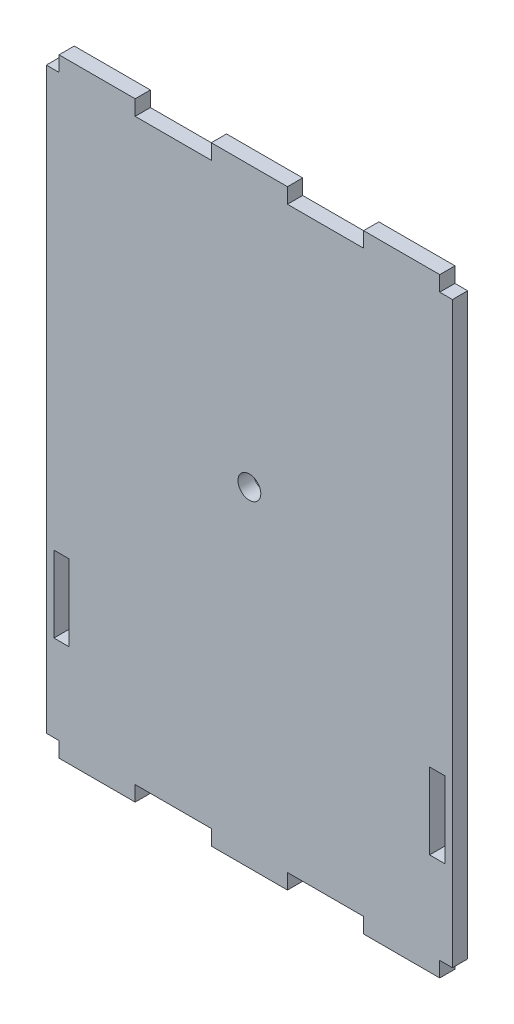
ISO-10303-21;
HEADER;
FILE_DESCRIPTION(('STEP AP214'),'2;1');
FILE_NAME('part.step','',(''),(''),'','','');
FILE_SCHEMA(('AUTOMOTIVE_DESIGN { 1 0 10303 214 1 1 1 1 }'));
ENDSEC;
DATA;
#1=APPLICATION_CONTEXT('core data for automotive mechanical design processes');
#2=APPLICATION_PROTOCOL_DEFINITION('international standard','automotive_design',2000,#1);
#3=PRODUCT_CONTEXT('',#1,'mechanical');
#4=PRODUCT('Part','Part','',(#3));
#5=PRODUCT_RELATED_PRODUCT_CATEGORY('part','',(#4));
#6=PRODUCT_DEFINITION_FORMATION('','',#4);
#7=PRODUCT_DEFINITION_CONTEXT('part definition',#1,'design');
#8=PRODUCT_DEFINITION('design','',#6,#7);
#9=PRODUCT_DEFINITION_SHAPE('','',#8);
#10=(LENGTH_UNIT() NAMED_UNIT(*) SI_UNIT(.MILLI.,.METRE.));
#11=(NAMED_UNIT(*) PLANE_ANGLE_UNIT() SI_UNIT($,.RADIAN.));
#12=(NAMED_UNIT(*) SI_UNIT($,.STERADIAN.) SOLID_ANGLE_UNIT());
#13=UNCERTAINTY_MEASURE_WITH_UNIT(LENGTH_MEASURE(1.E-05),#10,'distance_accuracy_value','');
#14=(GEOMETRIC_REPRESENTATION_CONTEXT(3) GLOBAL_UNCERTAINTY_ASSIGNED_CONTEXT((#13)) GLOBAL_UNIT_ASSIGNED_CONTEXT((#10,
#11,#12)) REPRESENTATION_CONTEXT('',''));
#15=CARTESIAN_POINT('',(0.,0.,0.));
#16=DIRECTION('',(0.,0.,1.));
#17=DIRECTION('',(1.,0.,0.));
#18=AXIS2_PLACEMENT_3D('',#15,#16,#17);
#19=CARTESIAN_POINT('',(0.,0.,3.));
#20=DIRECTION('',(0.,0.,-1.));
#21=DIRECTION('',(-1.,0.,0.));
#22=AXIS2_PLACEMENT_3D('',#19,#20,#21);
#23=PLANE('',#22);
#24=CARTESIAN_POINT('',(40.,65.,3.));
#25=DIRECTION('',(0.,0.,1.));
#26=DIRECTION('',(1.,0.,0.));
#27=AXIS2_PLACEMENT_3D('',#24,#25,#26);
#28=CIRCLE('',#27,2.25);
#29=CARTESIAN_POINT('',(42.25,65.,3.));
#30=VERTEX_POINT('',#29);
#31=EDGE_CURVE('E1194',#30,#30,#28,.T.);
#32=ORIENTED_EDGE('',*,*,#31,.F.);
#33=EDGE_LOOP('',(#32));
#34=FACE_BOUND('',#33,.T.);
#35=DIRECTION('',(0.,1.,0.));
#36=VECTOR('',#35,1.);
#37=CARTESIAN_POINT('',(78.5,20.,3.));
#38=LINE('',#37,#36);
#39=CARTESIAN_POINT('',(78.5,20.,3.));
#40=VERTEX_POINT('',#39);
#41=CARTESIAN_POINT('',(78.5,35.,3.));
#42=VERTEX_POINT('',#41);
#43=EDGE_CURVE('E326',#40,#42,#38,.T.);
#44=ORIENTED_EDGE('',*,*,#43,.F.);
#45=DIRECTION('',(1.,0.,0.));
#46=VECTOR('',#45,1.);
#47=CARTESIAN_POINT('',(78.5,20.,3.));
#48=LINE('',#47,#46);
#49=CARTESIAN_POINT('',(75.5,20.,3.));
#50=VERTEX_POINT('',#49);
#51=EDGE_CURVE('E337',#50,#40,#48,.T.);
#52=ORIENTED_EDGE('',*,*,#51,.F.);
#53=DIRECTION('',(0.,-1.,0.));
#54=VECTOR('',#53,1.);
#55=CARTESIAN_POINT('',(75.5,20.,3.));
#56=LINE('',#55,#54);
#57=CARTESIAN_POINT('',(75.5,35.,3.));
#58=VERTEX_POINT('',#57);
#59=EDGE_CURVE('E333',#58,#50,#56,.T.);
#60=ORIENTED_EDGE('',*,*,#59,.F.);
#61=DIRECTION('',(-1.,0.,0.));
#62=VECTOR('',#61,1.);
#63=CARTESIAN_POINT('',(78.5,35.,3.));
#64=LINE('',#63,#62);
#65=EDGE_CURVE('E329',#42,#58,#64,.T.);
#66=ORIENTED_EDGE('',*,*,#65,.F.);
#67=EDGE_LOOP('',(#44,#52,#60,#66));
#68=FACE_BOUND('',#67,.T.);
#69=DIRECTION('',(0.,-1.,0.));
#70=VECTOR('',#69,1.);
#71=CARTESIAN_POINT('',(32.5,0.,3.));
#72=LINE('',#71,#70);
#73=CARTESIAN_POINT('',(32.5,3.00000000000001,3.));
#74=VERTEX_POINT('',#73);
#75=CARTESIAN_POINT('',(32.5,0.,3.));
#76=VERTEX_POINT('',#75);
#77=EDGE_CURVE('E369',#74,#76,#72,.T.);
#78=ORIENTED_EDGE('',*,*,#77,.T.);
#79=DIRECTION('',(1.,0.,0.));
#80=VECTOR('',#79,1.);
#81=CARTESIAN_POINT('',(32.5,0.,3.));
#82=LINE('',#81,#80);
#83=CARTESIAN_POINT('',(47.5,0.,3.));
#84=VERTEX_POINT('',#83);
#85=EDGE_CURVE('E373',#76,#84,#82,.T.);
#86=ORIENTED_EDGE('',*,*,#85,.T.);
#87=DIRECTION('',(0.,1.,0.));
#88=VECTOR('',#87,1.);
#89=CARTESIAN_POINT('',(47.5,0.,3.));
#90=LINE('',#89,#88);
#91=CARTESIAN_POINT('',(47.5,3.00000000000002,3.));
#92=VERTEX_POINT('',#91);
#93=EDGE_CURVE('E377',#84,#92,#90,.T.);
#94=ORIENTED_EDGE('',*,*,#93,.T.);
#95=DIRECTION('',(1.,0.,0.));
#96=VECTOR('',#95,1.);
#97=CARTESIAN_POINT('',(47.5,3.00000000000002,3.));
#98=LINE('',#97,#96);
#99=CARTESIAN_POINT('',(62.5,3.00000000000002,3.));
#100=VERTEX_POINT('',#99);
#101=EDGE_CURVE('E380',#92,#100,#98,.T.);
#102=ORIENTED_EDGE('',*,*,#101,.T.);
#103=DIRECTION('',(0.,-1.,0.));
#104=VECTOR('',#103,1.);
#105=CARTESIAN_POINT('',(62.5,0.,3.));
#106=LINE('',#105,#104);
#107=CARTESIAN_POINT('',(62.5,0.,3.));
#108=VERTEX_POINT('',#107);
#109=EDGE_CURVE('E383',#100,#108,#106,.T.);
#110=ORIENTED_EDGE('',*,*,#109,.T.);
#111=DIRECTION('',(1.,0.,0.));
#112=VECTOR('',#111,1.);
#113=CARTESIAN_POINT('',(62.5,0.,3.));
#114=LINE('',#113,#112);
#115=CARTESIAN_POINT('',(77.5,0.,3.));
#116=VERTEX_POINT('',#115);
#117=EDGE_CURVE('E386',#108,#116,#114,.T.);
#118=ORIENTED_EDGE('',*,*,#117,.T.);
#119=DIRECTION('',(0.,1.,0.));
#120=VECTOR('',#119,1.);
#121=CARTESIAN_POINT('',(77.5,0.,3.));
#122=LINE('',#121,#120);
#123=CARTESIAN_POINT('',(77.5,3.00000000000003,3.));
#124=VERTEX_POINT('',#123);
#125=EDGE_CURVE('E389',#116,#124,#122,.T.);
#126=ORIENTED_EDGE('',*,*,#125,.T.);
#127=DIRECTION('',(1.,0.,0.));
#128=VECTOR('',#127,1.);
#129=CARTESIAN_POINT('',(77.5,3.00000000000003,3.));
#130=LINE('',#129,#128);
#131=CARTESIAN_POINT('',(80.,3.00000000000001,3.));
#132=VERTEX_POINT('',#131);
#133=EDGE_CURVE('E392',#124,#132,#130,.T.);
#134=ORIENTED_EDGE('',*,*,#133,.T.);
#135=DIRECTION('',(0.,1.,0.));
#136=VECTOR('',#135,1.);
#137=CARTESIAN_POINT('',(80.,3.00000000000001,3.));
#138=LINE('',#137,#136);
#139=CARTESIAN_POINT('',(80.,117.,3.));
#140=VERTEX_POINT('',#139);
#141=EDGE_CURVE('E395',#132,#140,#138,.T.);
#142=ORIENTED_EDGE('',*,*,#141,.T.);
#143=DIRECTION('',(-1.,0.,0.));
#144=VECTOR('',#143,1.);
#145=CARTESIAN_POINT('',(77.5,117.,3.));
#146=LINE('',#145,#144);
#147=CARTESIAN_POINT('',(77.5,117.,3.));
#148=VERTEX_POINT('',#147);
#149=EDGE_CURVE('E398',#140,#148,#146,.T.);
#150=ORIENTED_EDGE('',*,*,#149,.T.);
#151=DIRECTION('',(0.,1.,0.));
#152=VECTOR('',#151,1.);
#153=CARTESIAN_POINT('',(77.5,120.,3.));
#154=LINE('',#153,#152);
#155=CARTESIAN_POINT('',(77.5,120.,3.));
#156=VERTEX_POINT('',#155);
#157=EDGE_CURVE('E401',#148,#156,#154,.T.);
#158=ORIENTED_EDGE('',*,*,#157,.T.);
#159=DIRECTION('',(-1.,0.,0.));
#160=VECTOR('',#159,1.);
#161=CARTESIAN_POINT('',(77.5,120.,3.));
#162=LINE('',#161,#160);
#163=CARTESIAN_POINT('',(62.5,120.,3.));
#164=VERTEX_POINT('',#163);
#165=EDGE_CURVE('E404',#156,#164,#162,.T.);
#166=ORIENTED_EDGE('',*,*,#165,.T.);
#167=DIRECTION('',(0.,-1.,0.));
#168=VECTOR('',#167,1.);
#169=CARTESIAN_POINT('',(62.5,120.,3.));
#170=LINE('',#169,#168);
#171=CARTESIAN_POINT('',(62.5,117.,3.));
#172=VERTEX_POINT('',#171);
#173=EDGE_CURVE('E407',#164,#172,#170,.T.);
#174=ORIENTED_EDGE('',*,*,#173,.T.);
#175=DIRECTION('',(-1.,0.,0.));
#176=VECTOR('',#175,1.);
#177=CARTESIAN_POINT('',(47.5,117.,3.));
#178=LINE('',#177,#176);
#179=CARTESIAN_POINT('',(47.5,117.,3.));
#180=VERTEX_POINT('',#179);
#181=EDGE_CURVE('E410',#172,#180,#178,.T.);
#182=ORIENTED_EDGE('',*,*,#181,.T.);
#183=DIRECTION('',(0.,1.,0.));
#184=VECTOR('',#183,1.);
#185=CARTESIAN_POINT('',(47.5,120.,3.));
#186=LINE('',#185,#184);
#187=CARTESIAN_POINT('',(47.5,120.,3.));
#188=VERTEX_POINT('',#187);
#189=EDGE_CURVE('E413',#180,#188,#186,.T.);
#190=ORIENTED_EDGE('',*,*,#189,.T.);
#191=DIRECTION('',(-1.,0.,0.));
#192=VECTOR('',#191,1.);
#193=CARTESIAN_POINT('',(32.5,120.,3.));
#194=LINE('',#193,#192);
#195=CARTESIAN_POINT('',(32.5,120.,3.));
#196=VERTEX_POINT('',#195);
#197=EDGE_CURVE('E416',#188,#196,#194,.T.);
#198=ORIENTED_EDGE('',*,*,#197,.T.);
#199=DIRECTION('',(0.,-1.,0.));
#200=VECTOR('',#199,1.);
#201=CARTESIAN_POINT('',(32.5,120.,3.));
#202=LINE('',#201,#200);
#203=CARTESIAN_POINT('',(32.5,117.,3.));
#204=VERTEX_POINT('',#203);
#205=EDGE_CURVE('E419',#196,#204,#202,.T.);
#206=ORIENTED_EDGE('',*,*,#205,.T.);
#207=DIRECTION('',(-1.,0.,0.));
#208=VECTOR('',#207,1.);
#209=CARTESIAN_POINT('',(17.5,117.,3.));
#210=LINE('',#209,#208);
#211=CARTESIAN_POINT('',(17.5,117.,3.));
#212=VERTEX_POINT('',#211);
#213=EDGE_CURVE('E422',#204,#212,#210,.T.);
#214=ORIENTED_EDGE('',*,*,#213,.T.);
#215=DIRECTION('',(0.,1.,0.));
#216=VECTOR('',#215,1.);
#217=CARTESIAN_POINT('',(17.5,120.,3.));
#218=LINE('',#217,#216);
#219=CARTESIAN_POINT('',(17.5,120.,3.));
#220=VERTEX_POINT('',#219);
#221=EDGE_CURVE('E425',#212,#220,#218,.T.);
#222=ORIENTED_EDGE('',*,*,#221,.T.);
#223=DIRECTION('',(-1.,0.,0.));
#224=VECTOR('',#223,1.);
#225=CARTESIAN_POINT('',(2.5,120.,3.));
#226=LINE('',#225,#224);
#227=CARTESIAN_POINT('',(2.5,120.,3.));
#228=VERTEX_POINT('',#227);
#229=EDGE_CURVE('E428',#220,#228,#226,.T.);
#230=ORIENTED_EDGE('',*,*,#229,.T.);
#231=DIRECTION('',(0.,-1.,0.));
#232=VECTOR('',#231,1.);
#233=CARTESIAN_POINT('',(2.5,120.,3.));
#234=LINE('',#233,#232);
#235=CARTESIAN_POINT('',(2.5,117.,3.));
#236=VERTEX_POINT('',#235);
#237=EDGE_CURVE('E431',#228,#236,#234,.T.);
#238=ORIENTED_EDGE('',*,*,#237,.T.);
#239=DIRECTION('',(-1.,0.,0.));
#240=VECTOR('',#239,1.);
#241=CARTESIAN_POINT('',(2.5,117.,3.));
#242=LINE('',#241,#240);
#243=CARTESIAN_POINT('',(0.,117.,3.));
#244=VERTEX_POINT('',#243);
#245=EDGE_CURVE('E434',#236,#244,#242,.T.);
#246=ORIENTED_EDGE('',*,*,#245,.T.);
#247=DIRECTION('',(0.,-1.,0.));
#248=VECTOR('',#247,1.);
#249=CARTESIAN_POINT('',(0.,3.,3.));
#250=LINE('',#249,#248);
#251=CARTESIAN_POINT('',(0.,3.,3.));
#252=VERTEX_POINT('',#251);
#253=EDGE_CURVE('E437',#244,#252,#250,.T.);
#254=ORIENTED_EDGE('',*,*,#253,.T.);
#255=DIRECTION('',(1.,0.,0.));
#256=VECTOR('',#255,1.);
#257=CARTESIAN_POINT('',(2.5,3.,3.));
#258=LINE('',#257,#256);
#259=CARTESIAN_POINT('',(2.5,3.,3.));
#260=VERTEX_POINT('',#259);
#261=EDGE_CURVE('E440',#252,#260,#258,.T.);
#262=ORIENTED_EDGE('',*,*,#261,.T.);
#263=DIRECTION('',(0.,-1.,0.));
#264=VECTOR('',#263,1.);
#265=CARTESIAN_POINT('',(2.5,0.,3.));
#266=LINE('',#265,#264);
#267=CARTESIAN_POINT('',(2.5,0.,3.));
#268=VERTEX_POINT('',#267);
#269=EDGE_CURVE('E443',#260,#268,#266,.T.);
#270=ORIENTED_EDGE('',*,*,#269,.T.);
#271=DIRECTION('',(1.,0.,0.));
#272=VECTOR('',#271,1.);
#273=CARTESIAN_POINT('',(2.5,0.,3.));
#274=LINE('',#273,#272);
#275=CARTESIAN_POINT('',(17.5,0.,3.));
#276=VERTEX_POINT('',#275);
#277=EDGE_CURVE('E446',#268,#276,#274,.T.);
#278=ORIENTED_EDGE('',*,*,#277,.T.);
#279=DIRECTION('',(0.,1.,0.));
#280=VECTOR('',#279,1.);
#281=CARTESIAN_POINT('',(17.5,0.,3.));
#282=LINE('',#281,#280);
#283=CARTESIAN_POINT('',(17.5,3.,3.));
#284=VERTEX_POINT('',#283);
#285=EDGE_CURVE('E449',#276,#284,#282,.T.);
#286=ORIENTED_EDGE('',*,*,#285,.T.);
#287=DIRECTION('',(1.,0.,0.));
#288=VECTOR('',#287,1.);
#289=CARTESIAN_POINT('',(17.5,3.,3.));
#290=LINE('',#289,#288);
#291=EDGE_CURVE('E452',#284,#74,#290,.T.);
#292=ORIENTED_EDGE('',*,*,#291,.T.);
#293=EDGE_LOOP('',(#78,#86,#94,#102,#110,#118,#126,#134,#142,#150,#158,#166,#174,#182,#190,#198,
#206,#214,#222,#230,#238,#246,#254,#262,#270,#278,#286,#292));
#294=FACE_BOUND('',#293,.T.);
#295=DIRECTION('',(1.,0.,0.));
#296=VECTOR('',#295,1.);
#297=CARTESIAN_POINT('',(1.5,20.,3.));
#298=LINE('',#297,#296);
#299=CARTESIAN_POINT('',(1.5,20.,3.));
#300=VERTEX_POINT('',#299);
#301=CARTESIAN_POINT('',(4.5,20.,3.));
#302=VERTEX_POINT('',#301);
#303=EDGE_CURVE('E277',#300,#302,#298,.T.);
#304=ORIENTED_EDGE('',*,*,#303,.F.);
#305=DIRECTION('',(0.,-1.,0.));
#306=VECTOR('',#305,1.);
#307=CARTESIAN_POINT('',(1.5,20.,3.));
#308=LINE('',#307,#306);
#309=CARTESIAN_POINT('',(1.5,35.,3.));
#310=VERTEX_POINT('',#309);
#311=EDGE_CURVE('E303',#310,#300,#308,.T.);
#312=ORIENTED_EDGE('',*,*,#311,.F.);
#313=DIRECTION('',(-1.,0.,0.));
#314=VECTOR('',#313,1.);
#315=CARTESIAN_POINT('',(1.5,35.,3.));
#316=LINE('',#315,#314);
#317=CARTESIAN_POINT('',(4.5,35.,3.));
#318=VERTEX_POINT('',#317);
#319=EDGE_CURVE('E299',#318,#310,#316,.T.);
#320=ORIENTED_EDGE('',*,*,#319,.F.);
#321=DIRECTION('',(0.,1.,0.));
#322=VECTOR('',#321,1.);
#323=CARTESIAN_POINT('',(4.5,20.,3.));
#324=LINE('',#323,#322);
#325=EDGE_CURVE('E286',#302,#318,#324,.T.);
#326=ORIENTED_EDGE('',*,*,#325,.F.);
#327=EDGE_LOOP('',(#304,#312,#320,#326));
#328=FACE_BOUND('',#327,.T.);
#329=ADVANCED_FACE('F42',(#34,#68,#294,#328),#23,.F.);
#330=CARTESIAN_POINT('',(0.,0.,0.));
#331=DIRECTION('',(0.,0.,-1.));
#332=DIRECTION('',(-1.,0.,0.));
#333=AXIS2_PLACEMENT_3D('',#330,#331,#332);
#334=PLANE('',#333);
#335=CARTESIAN_POINT('',(40.,65.,0.));
#336=DIRECTION('',(0.,0.,-1.));
#337=DIRECTION('',(-1.,0.,0.));
#338=AXIS2_PLACEMENT_3D('',#335,#336,#337);
#339=CIRCLE('',#338,2.25);
#340=CARTESIAN_POINT('',(37.75,65.,0.));
#341=VERTEX_POINT('',#340);
#342=EDGE_CURVE('E46',#341,#341,#339,.T.);
#343=ORIENTED_EDGE('',*,*,#342,.F.);
#344=EDGE_LOOP('',(#343));
#345=FACE_BOUND('',#344,.T.);
#346=DIRECTION('',(0.,-1.,0.));
#347=VECTOR('',#346,1.);
#348=CARTESIAN_POINT('',(32.5,0.,0.));
#349=LINE('',#348,#347);
#350=CARTESIAN_POINT('',(32.5,3.00000000000001,0.));
#351=VERTEX_POINT('',#350);
#352=CARTESIAN_POINT('',(32.5,0.,0.));
#353=VERTEX_POINT('',#352);
#354=EDGE_CURVE('E368',#351,#353,#349,.T.);
#355=ORIENTED_EDGE('',*,*,#354,.F.);
#356=DIRECTION('',(1.,0.,0.));
#357=VECTOR('',#356,1.);
#358=CARTESIAN_POINT('',(17.5,3.,0.));
#359=LINE('',#358,#357);
#360=CARTESIAN_POINT('',(17.5,3.,0.));
#361=VERTEX_POINT('',#360);
#362=EDGE_CURVE('E374',#361,#351,#359,.T.);
#363=ORIENTED_EDGE('',*,*,#362,.F.);
#364=DIRECTION('',(0.,1.,0.));
#365=VECTOR('',#364,1.);
#366=CARTESIAN_POINT('',(17.5,0.,0.));
#367=LINE('',#366,#365);
#368=CARTESIAN_POINT('',(17.5,0.,0.));
#369=VERTEX_POINT('',#368);
#370=EDGE_CURVE('E534',#369,#361,#367,.T.);
#371=ORIENTED_EDGE('',*,*,#370,.F.);
#372=DIRECTION('',(1.,0.,0.));
#373=VECTOR('',#372,1.);
#374=CARTESIAN_POINT('',(2.5,0.,0.));
#375=LINE('',#374,#373);
#376=CARTESIAN_POINT('',(2.5,0.,0.));
#377=VERTEX_POINT('',#376);
#378=EDGE_CURVE('E531',#377,#369,#375,.T.);
#379=ORIENTED_EDGE('',*,*,#378,.F.);
#380=DIRECTION('',(0.,-1.,0.));
#381=VECTOR('',#380,1.);
#382=CARTESIAN_POINT('',(2.5,0.,0.));
#383=LINE('',#382,#381);
#384=CARTESIAN_POINT('',(2.5,3.,0.));
#385=VERTEX_POINT('',#384);
#386=EDGE_CURVE('E528',#385,#377,#383,.T.);
#387=ORIENTED_EDGE('',*,*,#386,.F.);
#388=DIRECTION('',(1.,0.,0.));
#389=VECTOR('',#388,1.);
#390=CARTESIAN_POINT('',(2.5,3.,0.));
#391=LINE('',#390,#389);
#392=CARTESIAN_POINT('',(0.,3.,0.));
#393=VERTEX_POINT('',#392);
#394=EDGE_CURVE('E525',#393,#385,#391,.T.);
#395=ORIENTED_EDGE('',*,*,#394,.F.);
#396=DIRECTION('',(0.,-1.,0.));
#397=VECTOR('',#396,1.);
#398=CARTESIAN_POINT('',(0.,3.,0.));
#399=LINE('',#398,#397);
#400=CARTESIAN_POINT('',(0.,117.,0.));
#401=VERTEX_POINT('',#400);
#402=EDGE_CURVE('E522',#401,#393,#399,.T.);
#403=ORIENTED_EDGE('',*,*,#402,.F.);
#404=DIRECTION('',(-1.,0.,0.));
#405=VECTOR('',#404,1.);
#406=CARTESIAN_POINT('',(2.5,117.,0.));
#407=LINE('',#406,#405);
#408=CARTESIAN_POINT('',(2.5,117.,0.));
#409=VERTEX_POINT('',#408);
#410=EDGE_CURVE('E519',#409,#401,#407,.T.);
#411=ORIENTED_EDGE('',*,*,#410,.F.);
#412=DIRECTION('',(0.,-1.,0.));
#413=VECTOR('',#412,1.);
#414=CARTESIAN_POINT('',(2.5,120.,0.));
#415=LINE('',#414,#413);
#416=CARTESIAN_POINT('',(2.5,120.,0.));
#417=VERTEX_POINT('',#416);
#418=EDGE_CURVE('E516',#417,#409,#415,.T.);
#419=ORIENTED_EDGE('',*,*,#418,.F.);
#420=DIRECTION('',(-1.,0.,0.));
#421=VECTOR('',#420,1.);
#422=CARTESIAN_POINT('',(2.5,120.,0.));
#423=LINE('',#422,#421);
#424=CARTESIAN_POINT('',(17.5,120.,0.));
#425=VERTEX_POINT('',#424);
#426=EDGE_CURVE('E513',#425,#417,#423,.T.);
#427=ORIENTED_EDGE('',*,*,#426,.F.);
#428=DIRECTION('',(0.,1.,0.));
#429=VECTOR('',#428,1.);
#430=CARTESIAN_POINT('',(17.5,120.,0.));
#431=LINE('',#430,#429);
#432=CARTESIAN_POINT('',(17.5,117.,0.));
#433=VERTEX_POINT('',#432);
#434=EDGE_CURVE('E510',#433,#425,#431,.T.);
#435=ORIENTED_EDGE('',*,*,#434,.F.);
#436=DIRECTION('',(-1.,0.,0.));
#437=VECTOR('',#436,1.);
#438=CARTESIAN_POINT('',(17.5,117.,0.));
#439=LINE('',#438,#437);
#440=CARTESIAN_POINT('',(32.5,117.,0.));
#441=VERTEX_POINT('',#440);
#442=EDGE_CURVE('E507',#441,#433,#439,.T.);
#443=ORIENTED_EDGE('',*,*,#442,.F.);
#444=DIRECTION('',(0.,-1.,0.));
#445=VECTOR('',#444,1.);
#446=CARTESIAN_POINT('',(32.5,120.,0.));
#447=LINE('',#446,#445);
#448=CARTESIAN_POINT('',(32.5,120.,0.));
#449=VERTEX_POINT('',#448);
#450=EDGE_CURVE('E504',#449,#441,#447,.T.);
#451=ORIENTED_EDGE('',*,*,#450,.F.);
#452=DIRECTION('',(-1.,0.,0.));
#453=VECTOR('',#452,1.);
#454=CARTESIAN_POINT('',(32.5,120.,0.));
#455=LINE('',#454,#453);
#456=CARTESIAN_POINT('',(47.5,120.,0.));
#457=VERTEX_POINT('',#456);
#458=EDGE_CURVE('E501',#457,#449,#455,.T.);
#459=ORIENTED_EDGE('',*,*,#458,.F.);
#460=DIRECTION('',(0.,1.,0.));
#461=VECTOR('',#460,1.);
#462=CARTESIAN_POINT('',(47.5,120.,0.));
#463=LINE('',#462,#461);
#464=CARTESIAN_POINT('',(47.5,117.,0.));
#465=VERTEX_POINT('',#464);
#466=EDGE_CURVE('E498',#465,#457,#463,.T.);
#467=ORIENTED_EDGE('',*,*,#466,.F.);
#468=DIRECTION('',(-1.,0.,0.));
#469=VECTOR('',#468,1.);
#470=CARTESIAN_POINT('',(47.5,117.,0.));
#471=LINE('',#470,#469);
#472=CARTESIAN_POINT('',(62.5,117.,0.));
#473=VERTEX_POINT('',#472);
#474=EDGE_CURVE('E495',#473,#465,#471,.T.);
#475=ORIENTED_EDGE('',*,*,#474,.F.);
#476=DIRECTION('',(0.,-1.,0.));
#477=VECTOR('',#476,1.);
#478=CARTESIAN_POINT('',(62.5,120.,0.));
#479=LINE('',#478,#477);
#480=CARTESIAN_POINT('',(62.5,120.,0.));
#481=VERTEX_POINT('',#480);
#482=EDGE_CURVE('E492',#481,#473,#479,.T.);
#483=ORIENTED_EDGE('',*,*,#482,.F.);
#484=DIRECTION('',(-1.,0.,0.));
#485=VECTOR('',#484,1.);
#486=CARTESIAN_POINT('',(77.5,120.,0.));
#487=LINE('',#486,#485);
#488=CARTESIAN_POINT('',(77.5,120.,0.));
#489=VERTEX_POINT('',#488);
#490=EDGE_CURVE('E489',#489,#481,#487,.T.);
#491=ORIENTED_EDGE('',*,*,#490,.F.);
#492=DIRECTION('',(0.,1.,0.));
#493=VECTOR('',#492,1.);
#494=CARTESIAN_POINT('',(77.5,120.,0.));
#495=LINE('',#494,#493);
#496=CARTESIAN_POINT('',(77.5,117.,0.));
#497=VERTEX_POINT('',#496);
#498=EDGE_CURVE('E486',#497,#489,#495,.T.);
#499=ORIENTED_EDGE('',*,*,#498,.F.);
#500=DIRECTION('',(-1.,0.,0.));
#501=VECTOR('',#500,1.);
#502=CARTESIAN_POINT('',(77.5,117.,0.));
#503=LINE('',#502,#501);
#504=CARTESIAN_POINT('',(80.,117.,0.));
#505=VERTEX_POINT('',#504);
#506=EDGE_CURVE('E483',#505,#497,#503,.T.);
#507=ORIENTED_EDGE('',*,*,#506,.F.);
#508=DIRECTION('',(0.,1.,0.));
#509=VECTOR('',#508,1.);
#510=CARTESIAN_POINT('',(80.,3.00000000000001,0.));
#511=LINE('',#510,#509);
#512=CARTESIAN_POINT('',(80.,3.00000000000001,0.));
#513=VERTEX_POINT('',#512);
#514=EDGE_CURVE('E480',#513,#505,#511,.T.);
#515=ORIENTED_EDGE('',*,*,#514,.F.);
#516=DIRECTION('',(1.,0.,0.));
#517=VECTOR('',#516,1.);
#518=CARTESIAN_POINT('',(77.5,3.00000000000003,0.));
#519=LINE('',#518,#517);
#520=CARTESIAN_POINT('',(77.5,3.00000000000003,0.));
#521=VERTEX_POINT('',#520);
#522=EDGE_CURVE('E477',#521,#513,#519,.T.);
#523=ORIENTED_EDGE('',*,*,#522,.F.);
#524=DIRECTION('',(0.,1.,0.));
#525=VECTOR('',#524,1.);
#526=CARTESIAN_POINT('',(77.5,0.,0.));
#527=LINE('',#526,#525);
#528=CARTESIAN_POINT('',(77.5,0.,0.));
#529=VERTEX_POINT('',#528);
#530=EDGE_CURVE('E474',#529,#521,#527,.T.);
#531=ORIENTED_EDGE('',*,*,#530,.F.);
#532=DIRECTION('',(1.,0.,0.));
#533=VECTOR('',#532,1.);
#534=CARTESIAN_POINT('',(62.5,0.,0.));
#535=LINE('',#534,#533);
#536=CARTESIAN_POINT('',(62.5,0.,0.));
#537=VERTEX_POINT('',#536);
#538=EDGE_CURVE('E471',#537,#529,#535,.T.);
#539=ORIENTED_EDGE('',*,*,#538,.F.);
#540=DIRECTION('',(0.,-1.,0.));
#541=VECTOR('',#540,1.);
#542=CARTESIAN_POINT('',(62.5,0.,0.));
#543=LINE('',#542,#541);
#544=CARTESIAN_POINT('',(62.5,3.00000000000002,0.));
#545=VERTEX_POINT('',#544);
#546=EDGE_CURVE('E468',#545,#537,#543,.T.);
#547=ORIENTED_EDGE('',*,*,#546,.F.);
#548=DIRECTION('',(1.,0.,0.));
#549=VECTOR('',#548,1.);
#550=CARTESIAN_POINT('',(47.5,3.00000000000002,0.));
#551=LINE('',#550,#549);
#552=CARTESIAN_POINT('',(47.5,3.00000000000002,0.));
#553=VERTEX_POINT('',#552);
#554=EDGE_CURVE('E465',#553,#545,#551,.T.);
#555=ORIENTED_EDGE('',*,*,#554,.F.);
#556=DIRECTION('',(0.,1.,0.));
#557=VECTOR('',#556,1.);
#558=CARTESIAN_POINT('',(47.5,0.,0.));
#559=LINE('',#558,#557);
#560=CARTESIAN_POINT('',(47.5,0.,0.));
#561=VERTEX_POINT('',#560);
#562=EDGE_CURVE('E462',#561,#553,#559,.T.);
#563=ORIENTED_EDGE('',*,*,#562,.F.);
#564=DIRECTION('',(1.,0.,0.));
#565=VECTOR('',#564,1.);
#566=CARTESIAN_POINT('',(32.5,0.,0.));
#567=LINE('',#566,#565);
#568=EDGE_CURVE('E459',#353,#561,#567,.T.);
#569=ORIENTED_EDGE('',*,*,#568,.F.);
#570=EDGE_LOOP('',(#355,#363,#371,#379,#387,#395,#403,#411,#419,#427,#435,#443,#451,#459,#467,
#475,#483,#491,#499,#507,#515,#523,#531,#539,#547,#555,#563,#569));
#571=FACE_BOUND('',#570,.T.);
#572=DIRECTION('',(1.,0.,0.));
#573=VECTOR('',#572,1.);
#574=CARTESIAN_POINT('',(78.5,20.,0.));
#575=LINE('',#574,#573);
#576=CARTESIAN_POINT('',(75.5,20.,0.));
#577=VERTEX_POINT('',#576);
#578=CARTESIAN_POINT('',(78.5,20.,0.));
#579=VERTEX_POINT('',#578);
#580=EDGE_CURVE('E330',#577,#579,#575,.T.);
#581=ORIENTED_EDGE('',*,*,#580,.T.);
#582=DIRECTION('',(0.,1.,0.));
#583=VECTOR('',#582,1.);
#584=CARTESIAN_POINT('',(78.5,20.,0.));
#585=LINE('',#584,#583);
#586=CARTESIAN_POINT('',(78.5,35.,0.));
#587=VERTEX_POINT('',#586);
#588=EDGE_CURVE('E295',#579,#587,#585,.T.);
#589=ORIENTED_EDGE('',*,*,#588,.T.);
#590=DIRECTION('',(-1.,0.,0.));
#591=VECTOR('',#590,1.);
#592=CARTESIAN_POINT('',(78.5,35.,0.));
#593=LINE('',#592,#591);
#594=CARTESIAN_POINT('',(75.5,35.,0.));
#595=VERTEX_POINT('',#594);
#596=EDGE_CURVE('E344',#587,#595,#593,.T.);
#597=ORIENTED_EDGE('',*,*,#596,.T.);
#598=DIRECTION('',(0.,-1.,0.));
#599=VECTOR('',#598,1.);
#600=CARTESIAN_POINT('',(75.5,20.,0.));
#601=LINE('',#600,#599);
#602=EDGE_CURVE('E348',#595,#577,#601,.T.);
#603=ORIENTED_EDGE('',*,*,#602,.T.);
#604=EDGE_LOOP('',(#581,#589,#597,#603));
#605=FACE_BOUND('',#604,.T.);
#606=DIRECTION('',(0.,-1.,0.));
#607=VECTOR('',#606,1.);
#608=CARTESIAN_POINT('',(1.5,20.,0.));
#609=LINE('',#608,#607);
#610=CARTESIAN_POINT('',(1.5,35.,0.));
#611=VERTEX_POINT('',#610);
#612=CARTESIAN_POINT('',(1.5,20.,0.));
#613=VERTEX_POINT('',#612);
#614=EDGE_CURVE('E287',#611,#613,#609,.T.);
#615=ORIENTED_EDGE('',*,*,#614,.T.);
#616=DIRECTION('',(1.,0.,0.));
#617=VECTOR('',#616,1.);
#618=CARTESIAN_POINT('',(1.5,20.,0.));
#619=LINE('',#618,#617);
#620=CARTESIAN_POINT('',(4.5,20.,0.));
#621=VERTEX_POINT('',#620);
#622=EDGE_CURVE('E67',#613,#621,#619,.T.);
#623=ORIENTED_EDGE('',*,*,#622,.T.);
#624=DIRECTION('',(0.,1.,0.));
#625=VECTOR('',#624,1.);
#626=CARTESIAN_POINT('',(4.5,20.,0.));
#627=LINE('',#626,#625);
#628=CARTESIAN_POINT('',(4.5,35.,0.));
#629=VERTEX_POINT('',#628);
#630=EDGE_CURVE('E293',#621,#629,#627,.T.);
#631=ORIENTED_EDGE('',*,*,#630,.T.);
#632=DIRECTION('',(-1.,0.,0.));
#633=VECTOR('',#632,1.);
#634=CARTESIAN_POINT('',(1.5,35.,0.));
#635=LINE('',#634,#633);
#636=EDGE_CURVE('E313',#629,#611,#635,.T.);
#637=ORIENTED_EDGE('',*,*,#636,.T.);
#638=EDGE_LOOP('',(#615,#623,#631,#637));
#639=FACE_BOUND('',#638,.T.);
#640=ADVANCED_FACE('F654',(#345,#571,#605,#639),#334,.T.);
#641=CARTESIAN_POINT('',(32.5,0.,3.));
#642=DIRECTION('',(1.,0.,0.));
#643=DIRECTION('',(0.,0.,-1.));
#644=AXIS2_PLACEMENT_3D('',#641,#642,#643);
#645=PLANE('',#644);
#646=ORIENTED_EDGE('',*,*,#354,.T.);
#647=DIRECTION('',(0.,0.,-1.));
#648=VECTOR('',#647,1.);
#649=CARTESIAN_POINT('',(32.5,0.,3.));
#650=LINE('',#649,#648);
#651=EDGE_CURVE('E11',#76,#353,#650,.T.);
#652=ORIENTED_EDGE('',*,*,#651,.F.);
#653=ORIENTED_EDGE('',*,*,#77,.F.);
#654=DIRECTION('',(0.,0.,-1.));
#655=VECTOR('',#654,1.);
#656=CARTESIAN_POINT('',(32.5,3.00000000000001,3.));
#657=LINE('',#656,#655);
#658=EDGE_CURVE('E455',#74,#351,#657,.T.);
#659=ORIENTED_EDGE('',*,*,#658,.T.);
#660=EDGE_LOOP('',(#646,#652,#653,#659));
#661=FACE_BOUND('',#660,.T.);
#662=ADVANCED_FACE('F44',(#661),#645,.F.);
#663=CARTESIAN_POINT('',(32.5,0.,3.));
#664=DIRECTION('',(0.,1.,0.));
#665=DIRECTION('',(0.,0.,1.));
#666=AXIS2_PLACEMENT_3D('',#663,#664,#665);
#667=PLANE('',#666);
#668=ORIENTED_EDGE('',*,*,#568,.T.);
#669=DIRECTION('',(0.,0.,-1.));
#670=VECTOR('',#669,1.);
#671=CARTESIAN_POINT('',(47.5,0.,3.));
#672=LINE('',#671,#670);
#673=EDGE_CURVE('E52',#84,#561,#672,.T.);
#674=ORIENTED_EDGE('',*,*,#673,.F.);
#675=ORIENTED_EDGE('',*,*,#85,.F.);
#676=ORIENTED_EDGE('',*,*,#651,.T.);
#677=EDGE_LOOP('',(#668,#674,#675,#676));
#678=FACE_BOUND('',#677,.T.);
#679=ADVANCED_FACE('F671',(#678),#667,.F.);
#680=CARTESIAN_POINT('',(47.5,0.,3.));
#681=DIRECTION('',(-1.,0.,0.));
#682=DIRECTION('',(0.,0.,1.));
#683=AXIS2_PLACEMENT_3D('',#680,#681,#682);
#684=PLANE('',#683);
#685=ORIENTED_EDGE('',*,*,#562,.T.);
#686=DIRECTION('',(0.,0.,-1.));
#687=VECTOR('',#686,1.);
#688=CARTESIAN_POINT('',(47.5,3.00000000000002,3.));
#689=LINE('',#688,#687);
#690=EDGE_CURVE('E638',#92,#553,#689,.T.);
#691=ORIENTED_EDGE('',*,*,#690,.F.);
#692=ORIENTED_EDGE('',*,*,#93,.F.);
#693=ORIENTED_EDGE('',*,*,#673,.T.);
#694=EDGE_LOOP('',(#685,#691,#692,#693));
#695=FACE_BOUND('',#694,.T.);
#696=ADVANCED_FACE('F648',(#695),#684,.F.);
#697=CARTESIAN_POINT('',(47.5,3.00000000000002,3.));
#698=DIRECTION('',(0.,1.,0.));
#699=DIRECTION('',(-1.,0.,0.));
#700=AXIS2_PLACEMENT_3D('',#697,#698,#699);
#701=PLANE('',#700);
#702=ORIENTED_EDGE('',*,*,#554,.T.);
#703=DIRECTION('',(0.,0.,-1.));
#704=VECTOR('',#703,1.);
#705=CARTESIAN_POINT('',(62.5,3.00000000000002,3.));
#706=LINE('',#705,#704);
#707=EDGE_CURVE('E634',#100,#545,#706,.T.);
#708=ORIENTED_EDGE('',*,*,#707,.F.);
#709=ORIENTED_EDGE('',*,*,#101,.F.);
#710=ORIENTED_EDGE('',*,*,#690,.T.);
#711=EDGE_LOOP('',(#702,#708,#709,#710));
#712=FACE_BOUND('',#711,.T.);
#713=ADVANCED_FACE('F660',(#712),#701,.F.);
#714=CARTESIAN_POINT('',(62.5,0.,3.));
#715=DIRECTION('',(1.,0.,0.));
#716=DIRECTION('',(0.,0.,-1.));
#717=AXIS2_PLACEMENT_3D('',#714,#715,#716);
#718=PLANE('',#717);
#719=ORIENTED_EDGE('',*,*,#546,.T.);
#720=DIRECTION('',(0.,0.,-1.));
#721=VECTOR('',#720,1.);
#722=CARTESIAN_POINT('',(62.5,0.,3.));
#723=LINE('',#722,#721);
#724=EDGE_CURVE('E630',#108,#537,#723,.T.);
#725=ORIENTED_EDGE('',*,*,#724,.F.);
#726=ORIENTED_EDGE('',*,*,#109,.F.);
#727=ORIENTED_EDGE('',*,*,#707,.T.);
#728=EDGE_LOOP('',(#719,#725,#726,#727));
#729=FACE_BOUND('',#728,.T.);
#730=ADVANCED_FACE('F664',(#729),#718,.F.);
#731=CARTESIAN_POINT('',(62.5,0.,3.));
#732=DIRECTION('',(0.,1.,0.));
#733=DIRECTION('',(0.,0.,1.));
#734=AXIS2_PLACEMENT_3D('',#731,#732,#733);
#735=PLANE('',#734);
#736=ORIENTED_EDGE('',*,*,#538,.T.);
#737=DIRECTION('',(0.,0.,-1.));
#738=VECTOR('',#737,1.);
#739=CARTESIAN_POINT('',(77.5,0.,3.));
#740=LINE('',#739,#738);
#741=EDGE_CURVE('E626',#116,#529,#740,.T.);
#742=ORIENTED_EDGE('',*,*,#741,.F.);
#743=ORIENTED_EDGE('',*,*,#117,.F.);
#744=ORIENTED_EDGE('',*,*,#724,.T.);
#745=EDGE_LOOP('',(#736,#742,#743,#744));
#746=FACE_BOUND('',#745,.T.);
#747=ADVANCED_FACE('F784',(#746),#735,.F.);
#748=CARTESIAN_POINT('',(77.5,0.,3.));
#749=DIRECTION('',(-1.,0.,0.));
#750=DIRECTION('',(0.,0.,1.));
#751=AXIS2_PLACEMENT_3D('',#748,#749,#750);
#752=PLANE('',#751);
#753=ORIENTED_EDGE('',*,*,#530,.T.);
#754=DIRECTION('',(0.,0.,-1.));
#755=VECTOR('',#754,1.);
#756=CARTESIAN_POINT('',(77.5,3.00000000000003,3.));
#757=LINE('',#756,#755);
#758=EDGE_CURVE('E622',#124,#521,#757,.T.);
#759=ORIENTED_EDGE('',*,*,#758,.F.);
#760=ORIENTED_EDGE('',*,*,#125,.F.);
#761=ORIENTED_EDGE('',*,*,#741,.T.);
#762=EDGE_LOOP('',(#753,#759,#760,#761));
#763=FACE_BOUND('',#762,.T.);
#764=ADVANCED_FACE('F781',(#763),#752,.F.);
#765=CARTESIAN_POINT('',(77.5,3.00000000000003,3.));
#766=DIRECTION('',(0.,1.,0.));
#767=DIRECTION('',(-1.,0.,0.));
#768=AXIS2_PLACEMENT_3D('',#765,#766,#767);
#769=PLANE('',#768);
#770=ORIENTED_EDGE('',*,*,#522,.T.);
#771=DIRECTION('',(0.,0.,-1.));
#772=VECTOR('',#771,1.);
#773=CARTESIAN_POINT('',(80.,3.00000000000001,3.));
#774=LINE('',#773,#772);
#775=EDGE_CURVE('E618',#132,#513,#774,.T.);
#776=ORIENTED_EDGE('',*,*,#775,.F.);
#777=ORIENTED_EDGE('',*,*,#133,.F.);
#778=ORIENTED_EDGE('',*,*,#758,.T.);
#779=EDGE_LOOP('',(#770,#776,#777,#778));
#780=FACE_BOUND('',#779,.T.);
#781=ADVANCED_FACE('F777',(#780),#769,.F.);
#782=CARTESIAN_POINT('',(80.,3.00000000000001,3.));
#783=DIRECTION('',(-1.,0.,0.));
#784=DIRECTION('',(0.,0.,1.));
#785=AXIS2_PLACEMENT_3D('',#782,#783,#784);
#786=PLANE('',#785);
#787=ORIENTED_EDGE('',*,*,#514,.T.);
#788=DIRECTION('',(0.,0.,-1.));
#789=VECTOR('',#788,1.);
#790=CARTESIAN_POINT('',(80.,117.,3.));
#791=LINE('',#790,#789);
#792=EDGE_CURVE('E614',#140,#505,#791,.T.);
#793=ORIENTED_EDGE('',*,*,#792,.F.);
#794=ORIENTED_EDGE('',*,*,#141,.F.);
#795=ORIENTED_EDGE('',*,*,#775,.T.);
#796=EDGE_LOOP('',(#787,#793,#794,#795));
#797=FACE_BOUND('',#796,.T.);
#798=ADVANCED_FACE('F773',(#797),#786,.F.);
#799=CARTESIAN_POINT('',(77.5,117.,3.));
#800=DIRECTION('',(0.,-1.,0.));
#801=DIRECTION('',(1.,0.,0.));
#802=AXIS2_PLACEMENT_3D('',#799,#800,#801);
#803=PLANE('',#802);
#804=ORIENTED_EDGE('',*,*,#506,.T.);
#805=DIRECTION('',(0.,0.,-1.));
#806=VECTOR('',#805,1.);
#807=CARTESIAN_POINT('',(77.5,117.,3.));
#808=LINE('',#807,#806);
#809=EDGE_CURVE('E610',#148,#497,#808,.T.);
#810=ORIENTED_EDGE('',*,*,#809,.F.);
#811=ORIENTED_EDGE('',*,*,#149,.F.);
#812=ORIENTED_EDGE('',*,*,#792,.T.);
#813=EDGE_LOOP('',(#804,#810,#811,#812));
#814=FACE_BOUND('',#813,.T.);
#815=ADVANCED_FACE('F768',(#814),#803,.F.);
#816=CARTESIAN_POINT('',(77.5,120.,3.));
#817=DIRECTION('',(-1.,0.,0.));
#818=DIRECTION('',(0.,0.,1.));
#819=AXIS2_PLACEMENT_3D('',#816,#817,#818);
#820=PLANE('',#819);
#821=ORIENTED_EDGE('',*,*,#498,.T.);
#822=DIRECTION('',(0.,0.,-1.));
#823=VECTOR('',#822,1.);
#824=CARTESIAN_POINT('',(77.5,120.,3.));
#825=LINE('',#824,#823);
#826=EDGE_CURVE('E606',#156,#489,#825,.T.);
#827=ORIENTED_EDGE('',*,*,#826,.F.);
#828=ORIENTED_EDGE('',*,*,#157,.F.);
#829=ORIENTED_EDGE('',*,*,#809,.T.);
#830=EDGE_LOOP('',(#821,#827,#828,#829));
#831=FACE_BOUND('',#830,.T.);
#832=ADVANCED_FACE('F762',(#831),#820,.F.);
#833=CARTESIAN_POINT('',(77.5,120.,3.));
#834=DIRECTION('',(0.,-1.,0.));
#835=DIRECTION('',(0.,0.,-1.));
#836=AXIS2_PLACEMENT_3D('',#833,#834,#835);
#837=PLANE('',#836);
#838=ORIENTED_EDGE('',*,*,#490,.T.);
#839=DIRECTION('',(0.,0.,-1.));
#840=VECTOR('',#839,1.);
#841=CARTESIAN_POINT('',(62.5,120.,3.));
#842=LINE('',#841,#840);
#843=EDGE_CURVE('E602',#164,#481,#842,.T.);
#844=ORIENTED_EDGE('',*,*,#843,.F.);
#845=ORIENTED_EDGE('',*,*,#165,.F.);
#846=ORIENTED_EDGE('',*,*,#826,.T.);
#847=EDGE_LOOP('',(#838,#844,#845,#846));
#848=FACE_BOUND('',#847,.T.);
#849=ADVANCED_FACE('F758',(#848),#837,.F.);
#850=CARTESIAN_POINT('',(62.5,120.,3.));
#851=DIRECTION('',(1.,0.,0.));
#852=DIRECTION('',(0.,0.,-1.));
#853=AXIS2_PLACEMENT_3D('',#850,#851,#852);
#854=PLANE('',#853);
#855=ORIENTED_EDGE('',*,*,#482,.T.);
#856=DIRECTION('',(0.,0.,-1.));
#857=VECTOR('',#856,1.);
#858=CARTESIAN_POINT('',(62.5,117.,3.));
#859=LINE('',#858,#857);
#860=EDGE_CURVE('E598',#172,#473,#859,.T.);
#861=ORIENTED_EDGE('',*,*,#860,.F.);
#862=ORIENTED_EDGE('',*,*,#173,.F.);
#863=ORIENTED_EDGE('',*,*,#843,.T.);
#864=EDGE_LOOP('',(#855,#861,#862,#863));
#865=FACE_BOUND('',#864,.T.);
#866=ADVANCED_FACE('F753',(#865),#854,.F.);
#867=CARTESIAN_POINT('',(47.5,117.,3.));
#868=DIRECTION('',(0.,-1.,0.));
#869=DIRECTION('',(1.,0.,0.));
#870=AXIS2_PLACEMENT_3D('',#867,#868,#869);
#871=PLANE('',#870);
#872=ORIENTED_EDGE('',*,*,#474,.T.);
#873=DIRECTION('',(0.,0.,-1.));
#874=VECTOR('',#873,1.);
#875=CARTESIAN_POINT('',(47.5,117.,3.));
#876=LINE('',#875,#874);
#877=EDGE_CURVE('E594',#180,#465,#876,.T.);
#878=ORIENTED_EDGE('',*,*,#877,.F.);
#879=ORIENTED_EDGE('',*,*,#181,.F.);
#880=ORIENTED_EDGE('',*,*,#860,.T.);
#881=EDGE_LOOP('',(#872,#878,#879,#880));
#882=FACE_BOUND('',#881,.T.);
#883=ADVANCED_FACE('F747',(#882),#871,.F.);
#884=CARTESIAN_POINT('',(47.5,120.,3.));
#885=DIRECTION('',(-1.,0.,0.));
#886=DIRECTION('',(0.,0.,1.));
#887=AXIS2_PLACEMENT_3D('',#884,#885,#886);
#888=PLANE('',#887);
#889=ORIENTED_EDGE('',*,*,#466,.T.);
#890=DIRECTION('',(0.,0.,-1.));
#891=VECTOR('',#890,1.);
#892=CARTESIAN_POINT('',(47.5,120.,3.));
#893=LINE('',#892,#891);
#894=EDGE_CURVE('E590',#188,#457,#893,.T.);
#895=ORIENTED_EDGE('',*,*,#894,.F.);
#896=ORIENTED_EDGE('',*,*,#189,.F.);
#897=ORIENTED_EDGE('',*,*,#877,.T.);
#898=EDGE_LOOP('',(#889,#895,#896,#897));
#899=FACE_BOUND('',#898,.T.);
#900=ADVANCED_FACE('F743',(#899),#888,.F.);
#901=CARTESIAN_POINT('',(32.5,120.,3.));
#902=DIRECTION('',(0.,-1.,0.));
#903=DIRECTION('',(0.,0.,-1.));
#904=AXIS2_PLACEMENT_3D('',#901,#902,#903);
#905=PLANE('',#904);
#906=ORIENTED_EDGE('',*,*,#458,.T.);
#907=DIRECTION('',(0.,0.,-1.));
#908=VECTOR('',#907,1.);
#909=CARTESIAN_POINT('',(32.5,120.,3.));
#910=LINE('',#909,#908);
#911=EDGE_CURVE('E586',#196,#449,#910,.T.);
#912=ORIENTED_EDGE('',*,*,#911,.F.);
#913=ORIENTED_EDGE('',*,*,#197,.F.);
#914=ORIENTED_EDGE('',*,*,#894,.T.);
#915=EDGE_LOOP('',(#906,#912,#913,#914));
#916=FACE_BOUND('',#915,.T.);
#917=ADVANCED_FACE('F738',(#916),#905,.F.);
#918=CARTESIAN_POINT('',(32.5,120.,3.));
#919=DIRECTION('',(1.,0.,0.));
#920=DIRECTION('',(0.,0.,-1.));
#921=AXIS2_PLACEMENT_3D('',#918,#919,#920);
#922=PLANE('',#921);
#923=ORIENTED_EDGE('',*,*,#450,.T.);
#924=DIRECTION('',(0.,0.,-1.));
#925=VECTOR('',#924,1.);
#926=CARTESIAN_POINT('',(32.5,117.,3.));
#927=LINE('',#926,#925);
#928=EDGE_CURVE('E582',#204,#441,#927,.T.);
#929=ORIENTED_EDGE('',*,*,#928,.F.);
#930=ORIENTED_EDGE('',*,*,#205,.F.);
#931=ORIENTED_EDGE('',*,*,#911,.T.);
#932=EDGE_LOOP('',(#923,#929,#930,#931));
#933=FACE_BOUND('',#932,.T.);
#934=ADVANCED_FACE('F732',(#933),#922,.F.);
#935=CARTESIAN_POINT('',(17.5,117.,3.));
#936=DIRECTION('',(0.,-1.,0.));
#937=DIRECTION('',(0.,0.,-1.));
#938=AXIS2_PLACEMENT_3D('',#935,#936,#937);
#939=PLANE('',#938);
#940=ORIENTED_EDGE('',*,*,#442,.T.);
#941=DIRECTION('',(0.,0.,-1.));
#942=VECTOR('',#941,1.);
#943=CARTESIAN_POINT('',(17.5,117.,3.));
#944=LINE('',#943,#942);
#945=EDGE_CURVE('E578',#212,#433,#944,.T.);
#946=ORIENTED_EDGE('',*,*,#945,.F.);
#947=ORIENTED_EDGE('',*,*,#213,.F.);
#948=ORIENTED_EDGE('',*,*,#928,.T.);
#949=EDGE_LOOP('',(#940,#946,#947,#948));
#950=FACE_BOUND('',#949,.T.);
#951=ADVANCED_FACE('F728',(#950),#939,.F.);
#952=CARTESIAN_POINT('',(17.5,120.,3.));
#953=DIRECTION('',(-1.,0.,0.));
#954=DIRECTION('',(0.,0.,1.));
#955=AXIS2_PLACEMENT_3D('',#952,#953,#954);
#956=PLANE('',#955);
#957=ORIENTED_EDGE('',*,*,#434,.T.);
#958=DIRECTION('',(0.,0.,-1.));
#959=VECTOR('',#958,1.);
#960=CARTESIAN_POINT('',(17.5,120.,3.));
#961=LINE('',#960,#959);
#962=EDGE_CURVE('E574',#220,#425,#961,.T.);
#963=ORIENTED_EDGE('',*,*,#962,.F.);
#964=ORIENTED_EDGE('',*,*,#221,.F.);
#965=ORIENTED_EDGE('',*,*,#945,.T.);
#966=EDGE_LOOP('',(#957,#963,#964,#965));
#967=FACE_BOUND('',#966,.T.);
#968=ADVANCED_FACE('F723',(#967),#956,.F.);
#969=CARTESIAN_POINT('',(2.5,120.,3.));
#970=DIRECTION('',(0.,-1.,0.));
#971=DIRECTION('',(0.,0.,-1.));
#972=AXIS2_PLACEMENT_3D('',#969,#970,#971);
#973=PLANE('',#972);
#974=ORIENTED_EDGE('',*,*,#426,.T.);
#975=DIRECTION('',(0.,0.,-1.));
#976=VECTOR('',#975,1.);
#977=CARTESIAN_POINT('',(2.5,120.,3.));
#978=LINE('',#977,#976);
#979=EDGE_CURVE('E570',#228,#417,#978,.T.);
#980=ORIENTED_EDGE('',*,*,#979,.F.);
#981=ORIENTED_EDGE('',*,*,#229,.F.);
#982=ORIENTED_EDGE('',*,*,#962,.T.);
#983=EDGE_LOOP('',(#974,#980,#981,#982));
#984=FACE_BOUND('',#983,.T.);
#985=ADVANCED_FACE('F717',(#984),#973,.F.);
#986=CARTESIAN_POINT('',(2.5,120.,3.));
#987=DIRECTION('',(1.,0.,0.));
#988=DIRECTION('',(0.,0.,-1.));
#989=AXIS2_PLACEMENT_3D('',#986,#987,#988);
#990=PLANE('',#989);
#991=ORIENTED_EDGE('',*,*,#418,.T.);
#992=DIRECTION('',(0.,0.,-1.));
#993=VECTOR('',#992,1.);
#994=CARTESIAN_POINT('',(2.5,117.,3.));
#995=LINE('',#994,#993);
#996=EDGE_CURVE('E566',#236,#409,#995,.T.);
#997=ORIENTED_EDGE('',*,*,#996,.F.);
#998=ORIENTED_EDGE('',*,*,#237,.F.);
#999=ORIENTED_EDGE('',*,*,#979,.T.);
#1000=EDGE_LOOP('',(#991,#997,#998,#999));
#1001=FACE_BOUND('',#1000,.T.);
#1002=ADVANCED_FACE('F713',(#1001),#990,.F.);
#1003=CARTESIAN_POINT('',(2.5,117.,3.));
#1004=DIRECTION('',(0.,-1.,0.));
#1005=DIRECTION('',(0.,0.,-1.));
#1006=AXIS2_PLACEMENT_3D('',#1003,#1004,#1005);
#1007=PLANE('',#1006);
#1008=ORIENTED_EDGE('',*,*,#410,.T.);
#1009=DIRECTION('',(0.,0.,-1.));
#1010=VECTOR('',#1009,1.);
#1011=CARTESIAN_POINT('',(0.,117.,3.));
#1012=LINE('',#1011,#1010);
#1013=EDGE_CURVE('E562',#244,#401,#1012,.T.);
#1014=ORIENTED_EDGE('',*,*,#1013,.F.);
#1015=ORIENTED_EDGE('',*,*,#245,.F.);
#1016=ORIENTED_EDGE('',*,*,#996,.T.);
#1017=EDGE_LOOP('',(#1008,#1014,#1015,#1016));
#1018=FACE_BOUND('',#1017,.T.);
#1019=ADVANCED_FACE('F708',(#1018),#1007,.F.);
#1020=CARTESIAN_POINT('',(0.,3.,3.));
#1021=DIRECTION('',(1.,0.,0.));
#1022=DIRECTION('',(0.,0.,-1.));
#1023=AXIS2_PLACEMENT_3D('',#1020,#1021,#1022);
#1024=PLANE('',#1023);
#1025=ORIENTED_EDGE('',*,*,#402,.T.);
#1026=DIRECTION('',(0.,0.,-1.));
#1027=VECTOR('',#1026,1.);
#1028=CARTESIAN_POINT('',(0.,3.,3.));
#1029=LINE('',#1028,#1027);
#1030=EDGE_CURVE('E558',#252,#393,#1029,.T.);
#1031=ORIENTED_EDGE('',*,*,#1030,.F.);
#1032=ORIENTED_EDGE('',*,*,#253,.F.);
#1033=ORIENTED_EDGE('',*,*,#1013,.T.);
#1034=EDGE_LOOP('',(#1025,#1031,#1032,#1033));
#1035=FACE_BOUND('',#1034,.T.);
#1036=ADVANCED_FACE('F702',(#1035),#1024,.F.);
#1037=CARTESIAN_POINT('',(2.5,3.,3.));
#1038=DIRECTION('',(0.,1.,0.));
#1039=DIRECTION('',(0.,0.,1.));
#1040=AXIS2_PLACEMENT_3D('',#1037,#1038,#1039);
#1041=PLANE('',#1040);
#1042=ORIENTED_EDGE('',*,*,#394,.T.);
#1043=DIRECTION('',(0.,0.,-1.));
#1044=VECTOR('',#1043,1.);
#1045=CARTESIAN_POINT('',(2.5,3.,3.));
#1046=LINE('',#1045,#1044);
#1047=EDGE_CURVE('E554',#260,#385,#1046,.T.);
#1048=ORIENTED_EDGE('',*,*,#1047,.F.);
#1049=ORIENTED_EDGE('',*,*,#261,.F.);
#1050=ORIENTED_EDGE('',*,*,#1030,.T.);
#1051=EDGE_LOOP('',(#1042,#1048,#1049,#1050));
#1052=FACE_BOUND('',#1051,.T.);
#1053=ADVANCED_FACE('F698',(#1052),#1041,.F.);
#1054=CARTESIAN_POINT('',(2.5,0.,3.));
#1055=DIRECTION('',(1.,0.,0.));
#1056=DIRECTION('',(0.,0.,-1.));
#1057=AXIS2_PLACEMENT_3D('',#1054,#1055,#1056);
#1058=PLANE('',#1057);
#1059=ORIENTED_EDGE('',*,*,#386,.T.);
#1060=DIRECTION('',(0.,0.,-1.));
#1061=VECTOR('',#1060,1.);
#1062=CARTESIAN_POINT('',(2.5,0.,3.));
#1063=LINE('',#1062,#1061);
#1064=EDGE_CURVE('E550',#268,#377,#1063,.T.);
#1065=ORIENTED_EDGE('',*,*,#1064,.F.);
#1066=ORIENTED_EDGE('',*,*,#269,.F.);
#1067=ORIENTED_EDGE('',*,*,#1047,.T.);
#1068=EDGE_LOOP('',(#1059,#1065,#1066,#1067));
#1069=FACE_BOUND('',#1068,.T.);
#1070=ADVANCED_FACE('F693',(#1069),#1058,.F.);
#1071=CARTESIAN_POINT('',(2.5,0.,3.));
#1072=DIRECTION('',(0.,1.,0.));
#1073=DIRECTION('',(0.,0.,1.));
#1074=AXIS2_PLACEMENT_3D('',#1071,#1072,#1073);
#1075=PLANE('',#1074);
#1076=ORIENTED_EDGE('',*,*,#378,.T.);
#1077=DIRECTION('',(0.,0.,-1.));
#1078=VECTOR('',#1077,1.);
#1079=CARTESIAN_POINT('',(17.5,0.,3.));
#1080=LINE('',#1079,#1078);
#1081=EDGE_CURVE('E546',#276,#369,#1080,.T.);
#1082=ORIENTED_EDGE('',*,*,#1081,.F.);
#1083=ORIENTED_EDGE('',*,*,#277,.F.);
#1084=ORIENTED_EDGE('',*,*,#1064,.T.);
#1085=EDGE_LOOP('',(#1076,#1082,#1083,#1084));
#1086=FACE_BOUND('',#1085,.T.);
#1087=ADVANCED_FACE('F687',(#1086),#1075,.F.);
#1088=CARTESIAN_POINT('',(17.5,0.,3.));
#1089=DIRECTION('',(-1.,0.,0.));
#1090=DIRECTION('',(0.,0.,1.));
#1091=AXIS2_PLACEMENT_3D('',#1088,#1089,#1090);
#1092=PLANE('',#1091);
#1093=ORIENTED_EDGE('',*,*,#370,.T.);
#1094=DIRECTION('',(0.,0.,-1.));
#1095=VECTOR('',#1094,1.);
#1096=CARTESIAN_POINT('',(17.5,3.,3.));
#1097=LINE('',#1096,#1095);
#1098=EDGE_CURVE('E542',#284,#361,#1097,.T.);
#1099=ORIENTED_EDGE('',*,*,#1098,.F.);
#1100=ORIENTED_EDGE('',*,*,#285,.F.);
#1101=ORIENTED_EDGE('',*,*,#1081,.T.);
#1102=EDGE_LOOP('',(#1093,#1099,#1100,#1101));
#1103=FACE_BOUND('',#1102,.T.);
#1104=ADVANCED_FACE('F683',(#1103),#1092,.F.);
#1105=CARTESIAN_POINT('',(17.5,3.,3.));
#1106=DIRECTION('',(0.,1.,0.));
#1107=DIRECTION('',(-1.,0.,0.));
#1108=AXIS2_PLACEMENT_3D('',#1105,#1106,#1107);
#1109=PLANE('',#1108);
#1110=ORIENTED_EDGE('',*,*,#362,.T.);
#1111=ORIENTED_EDGE('',*,*,#658,.F.);
#1112=ORIENTED_EDGE('',*,*,#291,.F.);
#1113=ORIENTED_EDGE('',*,*,#1098,.T.);
#1114=EDGE_LOOP('',(#1110,#1111,#1112,#1113));
#1115=FACE_BOUND('',#1114,.T.);
#1116=ADVANCED_FACE('F678',(#1115),#1109,.F.);
#1117=CARTESIAN_POINT('',(78.5,20.,3.));
#1118=DIRECTION('',(-1.,0.,0.));
#1119=DIRECTION('',(0.,0.,1.));
#1120=AXIS2_PLACEMENT_3D('',#1117,#1118,#1119);
#1121=PLANE('',#1120);
#1122=ORIENTED_EDGE('',*,*,#588,.F.);
#1123=DIRECTION('',(0.,0.,-1.));
#1124=VECTOR('',#1123,1.);
#1125=CARTESIAN_POINT('',(78.5,20.,3.));
#1126=LINE('',#1125,#1124);
#1127=EDGE_CURVE('E340',#40,#579,#1126,.T.);
#1128=ORIENTED_EDGE('',*,*,#1127,.F.);
#1129=ORIENTED_EDGE('',*,*,#43,.T.);
#1130=DIRECTION('',(0.,0.,-1.));
#1131=VECTOR('',#1130,1.);
#1132=CARTESIAN_POINT('',(78.5,35.,3.));
#1133=LINE('',#1132,#1131);
#1134=EDGE_CURVE('E364',#42,#587,#1133,.T.);
#1135=ORIENTED_EDGE('',*,*,#1134,.T.);
#1136=EDGE_LOOP('',(#1122,#1128,#1129,#1135));
#1137=FACE_BOUND('',#1136,.T.);
#1138=ADVANCED_FACE('F805',(#1137),#1121,.T.);
#1139=CARTESIAN_POINT('',(78.5,35.,3.));
#1140=DIRECTION('',(0.,-1.,0.));
#1141=DIRECTION('',(0.,0.,-1.));
#1142=AXIS2_PLACEMENT_3D('',#1139,#1140,#1141);
#1143=PLANE('',#1142);
#1144=ORIENTED_EDGE('',*,*,#596,.F.);
#1145=ORIENTED_EDGE('',*,*,#1134,.F.);
#1146=ORIENTED_EDGE('',*,*,#65,.T.);
#1147=DIRECTION('',(0.,0.,-1.));
#1148=VECTOR('',#1147,1.);
#1149=CARTESIAN_POINT('',(75.5,35.,3.));
#1150=LINE('',#1149,#1148);
#1151=EDGE_CURVE('E361',#58,#595,#1150,.T.);
#1152=ORIENTED_EDGE('',*,*,#1151,.T.);
#1153=EDGE_LOOP('',(#1144,#1145,#1146,#1152));
#1154=FACE_BOUND('',#1153,.T.);
#1155=ADVANCED_FACE('F939',(#1154),#1143,.T.);
#1156=CARTESIAN_POINT('',(75.5,20.,3.));
#1157=DIRECTION('',(1.,0.,0.));
#1158=DIRECTION('',(0.,0.,-1.));
#1159=AXIS2_PLACEMENT_3D('',#1156,#1157,#1158);
#1160=PLANE('',#1159);
#1161=ORIENTED_EDGE('',*,*,#602,.F.);
#1162=ORIENTED_EDGE('',*,*,#1151,.F.);
#1163=ORIENTED_EDGE('',*,*,#59,.T.);
#1164=DIRECTION('',(0.,0.,-1.));
#1165=VECTOR('',#1164,1.);
#1166=CARTESIAN_POINT('',(75.5,20.,3.));
#1167=LINE('',#1166,#1165);
#1168=EDGE_CURVE('E358',#50,#577,#1167,.T.);
#1169=ORIENTED_EDGE('',*,*,#1168,.T.);
#1170=EDGE_LOOP('',(#1161,#1162,#1163,#1169));
#1171=FACE_BOUND('',#1170,.T.);
#1172=ADVANCED_FACE('F946',(#1171),#1160,.T.);
#1173=CARTESIAN_POINT('',(78.5,20.,3.));
#1174=DIRECTION('',(0.,1.,0.));
#1175=DIRECTION('',(0.,0.,1.));
#1176=AXIS2_PLACEMENT_3D('',#1173,#1174,#1175);
#1177=PLANE('',#1176);
#1178=ORIENTED_EDGE('',*,*,#580,.F.);
#1179=ORIENTED_EDGE('',*,*,#1168,.F.);
#1180=ORIENTED_EDGE('',*,*,#51,.T.);
#1181=ORIENTED_EDGE('',*,*,#1127,.T.);
#1182=EDGE_LOOP('',(#1178,#1179,#1180,#1181));
#1183=FACE_BOUND('',#1182,.T.);
#1184=ADVANCED_FACE('F953',(#1183),#1177,.T.);
#1185=CARTESIAN_POINT('',(1.5,20.,3.));
#1186=DIRECTION('',(0.,1.,0.));
#1187=DIRECTION('',(0.,0.,1.));
#1188=AXIS2_PLACEMENT_3D('',#1185,#1186,#1187);
#1189=PLANE('',#1188);
#1190=ORIENTED_EDGE('',*,*,#622,.F.);
#1191=DIRECTION('',(0.,0.,-1.));
#1192=VECTOR('',#1191,1.);
#1193=CARTESIAN_POINT('',(1.5,20.,3.));
#1194=LINE('',#1193,#1192);
#1195=EDGE_CURVE('E281',#300,#613,#1194,.T.);
#1196=ORIENTED_EDGE('',*,*,#1195,.F.);
#1197=ORIENTED_EDGE('',*,*,#303,.T.);
#1198=DIRECTION('',(0.,0.,-1.));
#1199=VECTOR('',#1198,1.);
#1200=CARTESIAN_POINT('',(4.5,20.,3.));
#1201=LINE('',#1200,#1199);
#1202=EDGE_CURVE('E280',#302,#621,#1201,.T.);
#1203=ORIENTED_EDGE('',*,*,#1202,.T.);
#1204=EDGE_LOOP('',(#1190,#1196,#1197,#1203));
#1205=FACE_BOUND('',#1204,.T.);
#1206=ADVANCED_FACE('F279',(#1205),#1189,.T.);
#1207=CARTESIAN_POINT('',(4.5,20.,3.));
#1208=DIRECTION('',(-1.,0.,0.));
#1209=DIRECTION('',(0.,0.,1.));
#1210=AXIS2_PLACEMENT_3D('',#1207,#1208,#1209);
#1211=PLANE('',#1210);
#1212=ORIENTED_EDGE('',*,*,#630,.F.);
#1213=ORIENTED_EDGE('',*,*,#1202,.F.);
#1214=ORIENTED_EDGE('',*,*,#325,.T.);
#1215=DIRECTION('',(0.,0.,-1.));
#1216=VECTOR('',#1215,1.);
#1217=CARTESIAN_POINT('',(4.5,35.,3.));
#1218=LINE('',#1217,#1216);
#1219=EDGE_CURVE('E296',#318,#629,#1218,.T.);
#1220=ORIENTED_EDGE('',*,*,#1219,.T.);
#1221=EDGE_LOOP('',(#1212,#1213,#1214,#1220));
#1222=FACE_BOUND('',#1221,.T.);
#1223=ADVANCED_FACE('F290',(#1222),#1211,.T.);
#1224=CARTESIAN_POINT('',(1.5,35.,3.));
#1225=DIRECTION('',(0.,-1.,0.));
#1226=DIRECTION('',(0.,0.,-1.));
#1227=AXIS2_PLACEMENT_3D('',#1224,#1225,#1226);
#1228=PLANE('',#1227);
#1229=ORIENTED_EDGE('',*,*,#636,.F.);
#1230=ORIENTED_EDGE('',*,*,#1219,.F.);
#1231=ORIENTED_EDGE('',*,*,#319,.T.);
#1232=DIRECTION('',(0.,0.,-1.));
#1233=VECTOR('',#1232,1.);
#1234=CARTESIAN_POINT('',(1.5,35.,3.));
#1235=LINE('',#1234,#1233);
#1236=EDGE_CURVE('E59',#310,#611,#1235,.T.);
#1237=ORIENTED_EDGE('',*,*,#1236,.T.);
#1238=EDGE_LOOP('',(#1229,#1230,#1231,#1237));
#1239=FACE_BOUND('',#1238,.T.);
#1240=ADVANCED_FACE('F974',(#1239),#1228,.T.);
#1241=CARTESIAN_POINT('',(1.5,20.,3.));
#1242=DIRECTION('',(1.,0.,0.));
#1243=DIRECTION('',(0.,0.,-1.));
#1244=AXIS2_PLACEMENT_3D('',#1241,#1242,#1243);
#1245=PLANE('',#1244);
#1246=ORIENTED_EDGE('',*,*,#614,.F.);
#1247=ORIENTED_EDGE('',*,*,#1236,.F.);
#1248=ORIENTED_EDGE('',*,*,#311,.T.);
#1249=ORIENTED_EDGE('',*,*,#1195,.T.);
#1250=EDGE_LOOP('',(#1246,#1247,#1248,#1249));
#1251=FACE_BOUND('',#1250,.T.);
#1252=ADVANCED_FACE('F981',(#1251),#1245,.T.);
#1253=CARTESIAN_POINT('',(40.,65.,-7.));
#1254=DIRECTION('',(0.,0.,1.));
#1255=DIRECTION('',(1.,0.,0.));
#1256=AXIS2_PLACEMENT_3D('',#1253,#1254,#1255);
#1257=CYLINDRICAL_SURFACE('',#1256,2.25);
#1258=ORIENTED_EDGE('',*,*,#342,.T.);
#1259=EDGE_LOOP('',(#1258));
#1260=FACE_BOUND('',#1259,.T.);
#1261=ORIENTED_EDGE('',*,*,#31,.T.);
#1262=EDGE_LOOP('',(#1261));
#1263=FACE_BOUND('',#1262,.T.);
#1264=ADVANCED_FACE('F988',(#1260,#1263),#1257,.F.);
#1265=CLOSED_SHELL('',(#329,#640,#662,#679,#696,#713,#730,#747,#764,#781,#798,#815,#832,#849,
#866,#883,#900,#917,#934,#951,#968,#985,#1002,#1019,#1036,#1053,#1070,#1087,#1104,#1116,#1138,
#1155,#1172,#1184,#1206,#1223,#1240,#1252,#1264));
#1266=MANIFOLD_SOLID_BREP('B2',#1265);
#1267=ADVANCED_BREP_SHAPE_REPRESENTATION('',(#18,#1266),#14);
#1268=SHAPE_DEFINITION_REPRESENTATION(#9,#1267);
ENDSEC;
END-ISO-10303-21;
